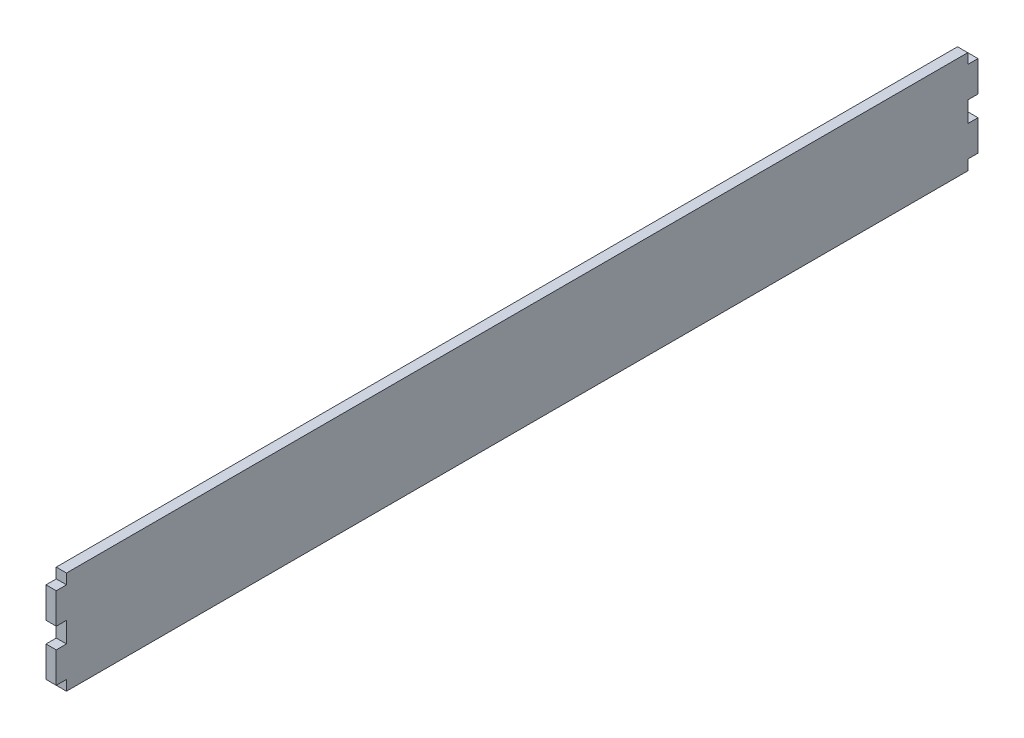
ISO-10303-21;
HEADER;
FILE_DESCRIPTION(('STEP AP214'),'2;1');
FILE_NAME('part.step','',(''),(''),'','','');
FILE_SCHEMA(('AUTOMOTIVE_DESIGN { 1 0 10303 214 1 1 1 1 }'));
ENDSEC;
DATA;
#1=APPLICATION_CONTEXT('core data for automotive mechanical design processes');
#2=APPLICATION_PROTOCOL_DEFINITION('international standard','automotive_design',2000,#1);
#3=PRODUCT_CONTEXT('',#1,'mechanical');
#4=PRODUCT('Part','Part','',(#3));
#5=PRODUCT_RELATED_PRODUCT_CATEGORY('part','',(#4));
#6=PRODUCT_DEFINITION_FORMATION('','',#4);
#7=PRODUCT_DEFINITION_CONTEXT('part definition',#1,'design');
#8=PRODUCT_DEFINITION('design','',#6,#7);
#9=PRODUCT_DEFINITION_SHAPE('','',#8);
#10=(LENGTH_UNIT() NAMED_UNIT(*) SI_UNIT(.MILLI.,.METRE.));
#11=(NAMED_UNIT(*) PLANE_ANGLE_UNIT() SI_UNIT($,.RADIAN.));
#12=(NAMED_UNIT(*) SI_UNIT($,.STERADIAN.) SOLID_ANGLE_UNIT());
#13=UNCERTAINTY_MEASURE_WITH_UNIT(LENGTH_MEASURE(1.E-05),#10,'distance_accuracy_value','');
#14=(GEOMETRIC_REPRESENTATION_CONTEXT(3) GLOBAL_UNCERTAINTY_ASSIGNED_CONTEXT((#13)) GLOBAL_UNIT_ASSIGNED_CONTEXT((#10,
#11,#12)) REPRESENTATION_CONTEXT('',''));
#15=CARTESIAN_POINT('',(0.,0.,0.));
#16=DIRECTION('',(0.,0.,1.));
#17=DIRECTION('',(1.,0.,0.));
#18=AXIS2_PLACEMENT_3D('',#15,#16,#17);
#19=CARTESIAN_POINT('',(5.,-20.,-220.));
#20=DIRECTION('',(0.,0.,1.));
#21=DIRECTION('',(1.,0.,0.));
#22=AXIS2_PLACEMENT_3D('',#19,#20,#21);
#23=PLANE('',#22);
#24=DIRECTION('',(0.,1.,0.));
#25=VECTOR('',#24,1.);
#26=CARTESIAN_POINT('',(0.,-20.,-220.));
#27=LINE('',#26,#25);
#28=CARTESIAN_POINT('',(0.,-25.,-220.));
#29=VERTEX_POINT('',#28);
#30=CARTESIAN_POINT('',(0.,-20.,-220.));
#31=VERTEX_POINT('',#30);
#32=EDGE_CURVE('E216',#29,#31,#27,.T.);
#33=ORIENTED_EDGE('',*,*,#32,.T.);
#34=DIRECTION('',(-1.,0.,0.));
#35=VECTOR('',#34,1.);
#36=CARTESIAN_POINT('',(5.,-20.,-220.));
#37=LINE('',#36,#35);
#38=CARTESIAN_POINT('',(5.,-20.,-220.));
#39=VERTEX_POINT('',#38);
#40=EDGE_CURVE('E11',#39,#31,#37,.T.);
#41=ORIENTED_EDGE('',*,*,#40,.F.);
#42=DIRECTION('',(0.,1.,0.));
#43=VECTOR('',#42,1.);
#44=CARTESIAN_POINT('',(5.,-20.,-220.));
#45=LINE('',#44,#43);
#46=CARTESIAN_POINT('',(5.,-25.,-220.));
#47=VERTEX_POINT('',#46);
#48=EDGE_CURVE('E274',#47,#39,#45,.T.);
#49=ORIENTED_EDGE('',*,*,#48,.F.);
#50=DIRECTION('',(-1.,0.,0.));
#51=VECTOR('',#50,1.);
#52=CARTESIAN_POINT('',(5.,-25.,-220.));
#53=LINE('',#52,#51);
#54=EDGE_CURVE('E212',#47,#29,#53,.T.);
#55=ORIENTED_EDGE('',*,*,#54,.T.);
#56=EDGE_LOOP('',(#33,#41,#49,#55));
#57=FACE_BOUND('',#56,.T.);
#58=ADVANCED_FACE('F43',(#57),#23,.F.);
#59=CARTESIAN_POINT('',(5.,-20.,-220.));
#60=DIRECTION('',(0.,1.,0.));
#61=DIRECTION('',(0.,0.,1.));
#62=AXIS2_PLACEMENT_3D('',#59,#60,#61);
#63=PLANE('',#62);
#64=DIRECTION('',(0.,0.,-1.));
#65=VECTOR('',#64,1.);
#66=CARTESIAN_POINT('',(0.,-20.,-220.));
#67=LINE('',#66,#65);
#68=CARTESIAN_POINT('',(0.,-20.,-225.));
#69=VERTEX_POINT('',#68);
#70=EDGE_CURVE('E220',#31,#69,#67,.T.);
#71=ORIENTED_EDGE('',*,*,#70,.T.);
#72=DIRECTION('',(-1.,0.,0.));
#73=VECTOR('',#72,1.);
#74=CARTESIAN_POINT('',(5.,-20.,-225.));
#75=LINE('',#74,#73);
#76=CARTESIAN_POINT('',(5.,-20.,-225.));
#77=VERTEX_POINT('',#76);
#78=EDGE_CURVE('E52',#77,#69,#75,.T.);
#79=ORIENTED_EDGE('',*,*,#78,.F.);
#80=DIRECTION('',(0.,0.,-1.));
#81=VECTOR('',#80,1.);
#82=CARTESIAN_POINT('',(5.,-20.,-220.));
#83=LINE('',#82,#81);
#84=EDGE_CURVE('E139',#39,#77,#83,.T.);
#85=ORIENTED_EDGE('',*,*,#84,.F.);
#86=ORIENTED_EDGE('',*,*,#40,.T.);
#87=EDGE_LOOP('',(#71,#79,#85,#86));
#88=FACE_BOUND('',#87,.T.);
#89=ADVANCED_FACE('F424',(#88),#63,.F.);
#90=CARTESIAN_POINT('',(5.,-5.,-225.));
#91=DIRECTION('',(0.,0.,1.));
#92=DIRECTION('',(1.,0.,0.));
#93=AXIS2_PLACEMENT_3D('',#90,#91,#92);
#94=PLANE('',#93);
#95=DIRECTION('',(0.,1.,0.));
#96=VECTOR('',#95,1.);
#97=CARTESIAN_POINT('',(0.,-5.,-225.));
#98=LINE('',#97,#96);
#99=CARTESIAN_POINT('',(0.,-5.,-225.));
#100=VERTEX_POINT('',#99);
#101=EDGE_CURVE('E223',#69,#100,#98,.T.);
#102=ORIENTED_EDGE('',*,*,#101,.T.);
#103=DIRECTION('',(-1.,0.,0.));
#104=VECTOR('',#103,1.);
#105=CARTESIAN_POINT('',(5.,-5.,-225.));
#106=LINE('',#105,#104);
#107=CARTESIAN_POINT('',(5.,-5.,-225.));
#108=VERTEX_POINT('',#107);
#109=EDGE_CURVE('E333',#108,#100,#106,.T.);
#110=ORIENTED_EDGE('',*,*,#109,.F.);
#111=DIRECTION('',(0.,1.,0.));
#112=VECTOR('',#111,1.);
#113=CARTESIAN_POINT('',(5.,-5.,-225.));
#114=LINE('',#113,#112);
#115=EDGE_CURVE('E343',#77,#108,#114,.T.);
#116=ORIENTED_EDGE('',*,*,#115,.F.);
#117=ORIENTED_EDGE('',*,*,#78,.T.);
#118=EDGE_LOOP('',(#102,#110,#116,#117));
#119=FACE_BOUND('',#118,.T.);
#120=ADVANCED_FACE('F341',(#119),#94,.F.);
#121=CARTESIAN_POINT('',(5.,-5.,-220.));
#122=DIRECTION('',(0.,-1.,0.));
#123=DIRECTION('',(0.,0.,-1.));
#124=AXIS2_PLACEMENT_3D('',#121,#122,#123);
#125=PLANE('',#124);
#126=DIRECTION('',(0.,0.,1.));
#127=VECTOR('',#126,1.);
#128=CARTESIAN_POINT('',(0.,-5.,-220.));
#129=LINE('',#128,#127);
#130=CARTESIAN_POINT('',(0.,-5.,-220.));
#131=VERTEX_POINT('',#130);
#132=EDGE_CURVE('E226',#100,#131,#129,.T.);
#133=ORIENTED_EDGE('',*,*,#132,.T.);
#134=DIRECTION('',(-1.,0.,0.));
#135=VECTOR('',#134,1.);
#136=CARTESIAN_POINT('',(5.,-5.,-220.));
#137=LINE('',#136,#135);
#138=CARTESIAN_POINT('',(5.,-5.,-220.));
#139=VERTEX_POINT('',#138);
#140=EDGE_CURVE('E329',#139,#131,#137,.T.);
#141=ORIENTED_EDGE('',*,*,#140,.F.);
#142=DIRECTION('',(0.,0.,1.));
#143=VECTOR('',#142,1.);
#144=CARTESIAN_POINT('',(5.,-5.,-220.));
#145=LINE('',#144,#143);
#146=EDGE_CURVE('E362',#108,#139,#145,.T.);
#147=ORIENTED_EDGE('',*,*,#146,.F.);
#148=ORIENTED_EDGE('',*,*,#109,.T.);
#149=EDGE_LOOP('',(#133,#141,#147,#148));
#150=FACE_BOUND('',#149,.T.);
#151=ADVANCED_FACE('F352',(#150),#125,.F.);
#152=CARTESIAN_POINT('',(5.,5.,-220.));
#153=DIRECTION('',(0.,0.,1.));
#154=DIRECTION('',(1.,0.,0.));
#155=AXIS2_PLACEMENT_3D('',#152,#153,#154);
#156=PLANE('',#155);
#157=DIRECTION('',(0.,1.,0.));
#158=VECTOR('',#157,1.);
#159=CARTESIAN_POINT('',(0.,5.,-220.));
#160=LINE('',#159,#158);
#161=CARTESIAN_POINT('',(0.,5.,-220.));
#162=VERTEX_POINT('',#161);
#163=EDGE_CURVE('E229',#131,#162,#160,.T.);
#164=ORIENTED_EDGE('',*,*,#163,.T.);
#165=DIRECTION('',(-1.,0.,0.));
#166=VECTOR('',#165,1.);
#167=CARTESIAN_POINT('',(5.,5.,-220.));
#168=LINE('',#167,#166);
#169=CARTESIAN_POINT('',(5.,5.,-220.));
#170=VERTEX_POINT('',#169);
#171=EDGE_CURVE('E325',#170,#162,#168,.T.);
#172=ORIENTED_EDGE('',*,*,#171,.F.);
#173=DIRECTION('',(0.,1.,0.));
#174=VECTOR('',#173,1.);
#175=CARTESIAN_POINT('',(5.,5.,-220.));
#176=LINE('',#175,#174);
#177=EDGE_CURVE('E358',#139,#170,#176,.T.);
#178=ORIENTED_EDGE('',*,*,#177,.F.);
#179=ORIENTED_EDGE('',*,*,#140,.T.);
#180=EDGE_LOOP('',(#164,#172,#178,#179));
#181=FACE_BOUND('',#180,.T.);
#182=ADVANCED_FACE('F356',(#181),#156,.F.);
#183=CARTESIAN_POINT('',(5.,5.,-220.));
#184=DIRECTION('',(0.,1.,0.));
#185=DIRECTION('',(0.,0.,1.));
#186=AXIS2_PLACEMENT_3D('',#183,#184,#185);
#187=PLANE('',#186);
#188=DIRECTION('',(0.,0.,-1.));
#189=VECTOR('',#188,1.);
#190=CARTESIAN_POINT('',(0.,5.,-220.));
#191=LINE('',#190,#189);
#192=CARTESIAN_POINT('',(0.,5.,-225.));
#193=VERTEX_POINT('',#192);
#194=EDGE_CURVE('E232',#162,#193,#191,.T.);
#195=ORIENTED_EDGE('',*,*,#194,.T.);
#196=DIRECTION('',(-1.,0.,0.));
#197=VECTOR('',#196,1.);
#198=CARTESIAN_POINT('',(5.,5.,-225.));
#199=LINE('',#198,#197);
#200=CARTESIAN_POINT('',(5.,5.,-225.));
#201=VERTEX_POINT('',#200);
#202=EDGE_CURVE('E321',#201,#193,#199,.T.);
#203=ORIENTED_EDGE('',*,*,#202,.F.);
#204=DIRECTION('',(0.,0.,-1.));
#205=VECTOR('',#204,1.);
#206=CARTESIAN_POINT('',(5.,5.,-220.));
#207=LINE('',#206,#205);
#208=EDGE_CURVE('E361',#170,#201,#207,.T.);
#209=ORIENTED_EDGE('',*,*,#208,.F.);
#210=ORIENTED_EDGE('',*,*,#171,.T.);
#211=EDGE_LOOP('',(#195,#203,#209,#210));
#212=FACE_BOUND('',#211,.T.);
#213=ADVANCED_FACE('F437',(#212),#187,.F.);
#214=CARTESIAN_POINT('',(5.,20.,-225.));
#215=DIRECTION('',(0.,0.,1.));
#216=DIRECTION('',(1.,0.,0.));
#217=AXIS2_PLACEMENT_3D('',#214,#215,#216);
#218=PLANE('',#217);
#219=DIRECTION('',(0.,1.,0.));
#220=VECTOR('',#219,1.);
#221=CARTESIAN_POINT('',(0.,20.,-225.));
#222=LINE('',#221,#220);
#223=CARTESIAN_POINT('',(0.,20.,-225.));
#224=VERTEX_POINT('',#223);
#225=EDGE_CURVE('E235',#193,#224,#222,.T.);
#226=ORIENTED_EDGE('',*,*,#225,.T.);
#227=DIRECTION('',(-1.,0.,0.));
#228=VECTOR('',#227,1.);
#229=CARTESIAN_POINT('',(5.,20.,-225.));
#230=LINE('',#229,#228);
#231=CARTESIAN_POINT('',(5.,20.,-225.));
#232=VERTEX_POINT('',#231);
#233=EDGE_CURVE('E317',#232,#224,#230,.T.);
#234=ORIENTED_EDGE('',*,*,#233,.F.);
#235=DIRECTION('',(0.,1.,0.));
#236=VECTOR('',#235,1.);
#237=CARTESIAN_POINT('',(5.,20.,-225.));
#238=LINE('',#237,#236);
#239=EDGE_CURVE('E366',#201,#232,#238,.T.);
#240=ORIENTED_EDGE('',*,*,#239,.F.);
#241=ORIENTED_EDGE('',*,*,#202,.T.);
#242=EDGE_LOOP('',(#226,#234,#240,#241));
#243=FACE_BOUND('',#242,.T.);
#244=ADVANCED_FACE('F440',(#243),#218,.F.);
#245=CARTESIAN_POINT('',(5.,20.,-220.));
#246=DIRECTION('',(0.,-1.,0.));
#247=DIRECTION('',(0.,0.,-1.));
#248=AXIS2_PLACEMENT_3D('',#245,#246,#247);
#249=PLANE('',#248);
#250=DIRECTION('',(0.,0.,1.));
#251=VECTOR('',#250,1.);
#252=CARTESIAN_POINT('',(0.,20.,-220.));
#253=LINE('',#252,#251);
#254=CARTESIAN_POINT('',(0.,20.,-220.));
#255=VERTEX_POINT('',#254);
#256=EDGE_CURVE('E238',#224,#255,#253,.T.);
#257=ORIENTED_EDGE('',*,*,#256,.T.);
#258=DIRECTION('',(-1.,0.,0.));
#259=VECTOR('',#258,1.);
#260=CARTESIAN_POINT('',(5.,20.,-220.));
#261=LINE('',#260,#259);
#262=CARTESIAN_POINT('',(5.,20.,-220.));
#263=VERTEX_POINT('',#262);
#264=EDGE_CURVE('E313',#263,#255,#261,.T.);
#265=ORIENTED_EDGE('',*,*,#264,.F.);
#266=DIRECTION('',(0.,0.,1.));
#267=VECTOR('',#266,1.);
#268=CARTESIAN_POINT('',(5.,20.,-220.));
#269=LINE('',#268,#267);
#270=EDGE_CURVE('E373',#232,#263,#269,.T.);
#271=ORIENTED_EDGE('',*,*,#270,.F.);
#272=ORIENTED_EDGE('',*,*,#233,.T.);
#273=EDGE_LOOP('',(#257,#265,#271,#272));
#274=FACE_BOUND('',#273,.T.);
#275=ADVANCED_FACE('F444',(#274),#249,.F.);
#276=CARTESIAN_POINT('',(5.,25.,-220.));
#277=DIRECTION('',(0.,0.,1.));
#278=DIRECTION('',(1.,0.,0.));
#279=AXIS2_PLACEMENT_3D('',#276,#277,#278);
#280=PLANE('',#279);
#281=DIRECTION('',(0.,1.,0.));
#282=VECTOR('',#281,1.);
#283=CARTESIAN_POINT('',(0.,25.,-220.));
#284=LINE('',#283,#282);
#285=CARTESIAN_POINT('',(0.,25.,-220.));
#286=VERTEX_POINT('',#285);
#287=EDGE_CURVE('E241',#255,#286,#284,.T.);
#288=ORIENTED_EDGE('',*,*,#287,.T.);
#289=DIRECTION('',(-1.,0.,0.));
#290=VECTOR('',#289,1.);
#291=CARTESIAN_POINT('',(5.,25.,-220.));
#292=LINE('',#291,#290);
#293=CARTESIAN_POINT('',(5.,25.,-220.));
#294=VERTEX_POINT('',#293);
#295=EDGE_CURVE('E309',#294,#286,#292,.T.);
#296=ORIENTED_EDGE('',*,*,#295,.F.);
#297=DIRECTION('',(0.,1.,0.));
#298=VECTOR('',#297,1.);
#299=CARTESIAN_POINT('',(5.,25.,-220.));
#300=LINE('',#299,#298);
#301=EDGE_CURVE('E376',#263,#294,#300,.T.);
#302=ORIENTED_EDGE('',*,*,#301,.F.);
#303=ORIENTED_EDGE('',*,*,#264,.T.);
#304=EDGE_LOOP('',(#288,#296,#302,#303));
#305=FACE_BOUND('',#304,.T.);
#306=ADVANCED_FACE('F448',(#305),#280,.F.);
#307=CARTESIAN_POINT('',(5.,25.,220.));
#308=DIRECTION('',(0.,-1.,0.));
#309=DIRECTION('',(0.,0.,-1.));
#310=AXIS2_PLACEMENT_3D('',#307,#308,#309);
#311=PLANE('',#310);
#312=DIRECTION('',(0.,0.,1.));
#313=VECTOR('',#312,1.);
#314=CARTESIAN_POINT('',(0.,25.,220.));
#315=LINE('',#314,#313);
#316=CARTESIAN_POINT('',(0.,25.,220.));
#317=VERTEX_POINT('',#316);
#318=EDGE_CURVE('E244',#286,#317,#315,.T.);
#319=ORIENTED_EDGE('',*,*,#318,.T.);
#320=DIRECTION('',(-1.,0.,0.));
#321=VECTOR('',#320,1.);
#322=CARTESIAN_POINT('',(5.,25.,220.));
#323=LINE('',#322,#321);
#324=CARTESIAN_POINT('',(5.,25.,220.));
#325=VERTEX_POINT('',#324);
#326=EDGE_CURVE('E305',#325,#317,#323,.T.);
#327=ORIENTED_EDGE('',*,*,#326,.F.);
#328=DIRECTION('',(0.,0.,1.));
#329=VECTOR('',#328,1.);
#330=CARTESIAN_POINT('',(5.,25.,220.));
#331=LINE('',#330,#329);
#332=EDGE_CURVE('E379',#294,#325,#331,.T.);
#333=ORIENTED_EDGE('',*,*,#332,.F.);
#334=ORIENTED_EDGE('',*,*,#295,.T.);
#335=EDGE_LOOP('',(#319,#327,#333,#334));
#336=FACE_BOUND('',#335,.T.);
#337=ADVANCED_FACE('F452',(#336),#311,.F.);
#338=CARTESIAN_POINT('',(5.,25.,220.));
#339=DIRECTION('',(0.,0.,-1.));
#340=DIRECTION('',(-1.,0.,0.));
#341=AXIS2_PLACEMENT_3D('',#338,#339,#340);
#342=PLANE('',#341);
#343=DIRECTION('',(0.,-1.,0.));
#344=VECTOR('',#343,1.);
#345=CARTESIAN_POINT('',(0.,25.,220.));
#346=LINE('',#345,#344);
#347=CARTESIAN_POINT('',(0.,20.,220.));
#348=VERTEX_POINT('',#347);
#349=EDGE_CURVE('E247',#317,#348,#346,.T.);
#350=ORIENTED_EDGE('',*,*,#349,.T.);
#351=DIRECTION('',(-1.,0.,0.));
#352=VECTOR('',#351,1.);
#353=CARTESIAN_POINT('',(5.,20.,220.));
#354=LINE('',#353,#352);
#355=CARTESIAN_POINT('',(5.,20.,220.));
#356=VERTEX_POINT('',#355);
#357=EDGE_CURVE('E301',#356,#348,#354,.T.);
#358=ORIENTED_EDGE('',*,*,#357,.F.);
#359=DIRECTION('',(0.,-1.,0.));
#360=VECTOR('',#359,1.);
#361=CARTESIAN_POINT('',(5.,25.,220.));
#362=LINE('',#361,#360);
#363=EDGE_CURVE('E382',#325,#356,#362,.T.);
#364=ORIENTED_EDGE('',*,*,#363,.F.);
#365=ORIENTED_EDGE('',*,*,#326,.T.);
#366=EDGE_LOOP('',(#350,#358,#364,#365));
#367=FACE_BOUND('',#366,.T.);
#368=ADVANCED_FACE('F456',(#367),#342,.F.);
#369=CARTESIAN_POINT('',(5.,20.,220.));
#370=DIRECTION('',(0.,-1.,0.));
#371=DIRECTION('',(0.,0.,-1.));
#372=AXIS2_PLACEMENT_3D('',#369,#370,#371);
#373=PLANE('',#372);
#374=DIRECTION('',(0.,0.,1.));
#375=VECTOR('',#374,1.);
#376=CARTESIAN_POINT('',(0.,20.,220.));
#377=LINE('',#376,#375);
#378=CARTESIAN_POINT('',(0.,20.,225.));
#379=VERTEX_POINT('',#378);
#380=EDGE_CURVE('E250',#348,#379,#377,.T.);
#381=ORIENTED_EDGE('',*,*,#380,.T.);
#382=DIRECTION('',(-1.,0.,0.));
#383=VECTOR('',#382,1.);
#384=CARTESIAN_POINT('',(5.,20.,225.));
#385=LINE('',#384,#383);
#386=CARTESIAN_POINT('',(5.,20.,225.));
#387=VERTEX_POINT('',#386);
#388=EDGE_CURVE('E297',#387,#379,#385,.T.);
#389=ORIENTED_EDGE('',*,*,#388,.F.);
#390=DIRECTION('',(0.,0.,1.));
#391=VECTOR('',#390,1.);
#392=CARTESIAN_POINT('',(5.,20.,220.));
#393=LINE('',#392,#391);
#394=EDGE_CURVE('E385',#356,#387,#393,.T.);
#395=ORIENTED_EDGE('',*,*,#394,.F.);
#396=ORIENTED_EDGE('',*,*,#357,.T.);
#397=EDGE_LOOP('',(#381,#389,#395,#396));
#398=FACE_BOUND('',#397,.T.);
#399=ADVANCED_FACE('F460',(#398),#373,.F.);
#400=CARTESIAN_POINT('',(5.,20.,225.));
#401=DIRECTION('',(0.,0.,-1.));
#402=DIRECTION('',(-1.,0.,0.));
#403=AXIS2_PLACEMENT_3D('',#400,#401,#402);
#404=PLANE('',#403);
#405=DIRECTION('',(0.,-1.,0.));
#406=VECTOR('',#405,1.);
#407=CARTESIAN_POINT('',(0.,20.,225.));
#408=LINE('',#407,#406);
#409=CARTESIAN_POINT('',(0.,5.,225.));
#410=VERTEX_POINT('',#409);
#411=EDGE_CURVE('E253',#379,#410,#408,.T.);
#412=ORIENTED_EDGE('',*,*,#411,.T.);
#413=DIRECTION('',(-1.,0.,0.));
#414=VECTOR('',#413,1.);
#415=CARTESIAN_POINT('',(5.,5.,225.));
#416=LINE('',#415,#414);
#417=CARTESIAN_POINT('',(5.,5.,225.));
#418=VERTEX_POINT('',#417);
#419=EDGE_CURVE('E293',#418,#410,#416,.T.);
#420=ORIENTED_EDGE('',*,*,#419,.F.);
#421=DIRECTION('',(0.,-1.,0.));
#422=VECTOR('',#421,1.);
#423=CARTESIAN_POINT('',(5.,20.,225.));
#424=LINE('',#423,#422);
#425=EDGE_CURVE('E388',#387,#418,#424,.T.);
#426=ORIENTED_EDGE('',*,*,#425,.F.);
#427=ORIENTED_EDGE('',*,*,#388,.T.);
#428=EDGE_LOOP('',(#412,#420,#426,#427));
#429=FACE_BOUND('',#428,.T.);
#430=ADVANCED_FACE('F464',(#429),#404,.F.);
#431=CARTESIAN_POINT('',(5.,5.,220.));
#432=DIRECTION('',(0.,1.,0.));
#433=DIRECTION('',(0.,0.,1.));
#434=AXIS2_PLACEMENT_3D('',#431,#432,#433);
#435=PLANE('',#434);
#436=DIRECTION('',(0.,0.,-1.));
#437=VECTOR('',#436,1.);
#438=CARTESIAN_POINT('',(0.,5.,220.));
#439=LINE('',#438,#437);
#440=CARTESIAN_POINT('',(0.,5.,220.));
#441=VERTEX_POINT('',#440);
#442=EDGE_CURVE('E256',#410,#441,#439,.T.);
#443=ORIENTED_EDGE('',*,*,#442,.T.);
#444=DIRECTION('',(-1.,0.,0.));
#445=VECTOR('',#444,1.);
#446=CARTESIAN_POINT('',(5.,5.,220.));
#447=LINE('',#446,#445);
#448=CARTESIAN_POINT('',(5.,5.,220.));
#449=VERTEX_POINT('',#448);
#450=EDGE_CURVE('E289',#449,#441,#447,.T.);
#451=ORIENTED_EDGE('',*,*,#450,.F.);
#452=DIRECTION('',(0.,0.,-1.));
#453=VECTOR('',#452,1.);
#454=CARTESIAN_POINT('',(5.,5.,220.));
#455=LINE('',#454,#453);
#456=EDGE_CURVE('E391',#418,#449,#455,.T.);
#457=ORIENTED_EDGE('',*,*,#456,.F.);
#458=ORIENTED_EDGE('',*,*,#419,.T.);
#459=EDGE_LOOP('',(#443,#451,#457,#458));
#460=FACE_BOUND('',#459,.T.);
#461=ADVANCED_FACE('F468',(#460),#435,.F.);
#462=CARTESIAN_POINT('',(5.,5.,220.));
#463=DIRECTION('',(0.,0.,-1.));
#464=DIRECTION('',(-1.,0.,0.));
#465=AXIS2_PLACEMENT_3D('',#462,#463,#464);
#466=PLANE('',#465);
#467=DIRECTION('',(0.,-1.,0.));
#468=VECTOR('',#467,1.);
#469=CARTESIAN_POINT('',(0.,5.,220.));
#470=LINE('',#469,#468);
#471=CARTESIAN_POINT('',(0.,-5.,220.));
#472=VERTEX_POINT('',#471);
#473=EDGE_CURVE('E259',#441,#472,#470,.T.);
#474=ORIENTED_EDGE('',*,*,#473,.T.);
#475=DIRECTION('',(-1.,0.,0.));
#476=VECTOR('',#475,1.);
#477=CARTESIAN_POINT('',(5.,-5.,220.));
#478=LINE('',#477,#476);
#479=CARTESIAN_POINT('',(5.,-5.,220.));
#480=VERTEX_POINT('',#479);
#481=EDGE_CURVE('E285',#480,#472,#478,.T.);
#482=ORIENTED_EDGE('',*,*,#481,.F.);
#483=DIRECTION('',(0.,-1.,0.));
#484=VECTOR('',#483,1.);
#485=CARTESIAN_POINT('',(5.,5.,220.));
#486=LINE('',#485,#484);
#487=EDGE_CURVE('E394',#449,#480,#486,.T.);
#488=ORIENTED_EDGE('',*,*,#487,.F.);
#489=ORIENTED_EDGE('',*,*,#450,.T.);
#490=EDGE_LOOP('',(#474,#482,#488,#489));
#491=FACE_BOUND('',#490,.T.);
#492=ADVANCED_FACE('F472',(#491),#466,.F.);
#493=CARTESIAN_POINT('',(5.,-5.,220.));
#494=DIRECTION('',(0.,-1.,0.));
#495=DIRECTION('',(0.,0.,-1.));
#496=AXIS2_PLACEMENT_3D('',#493,#494,#495);
#497=PLANE('',#496);
#498=DIRECTION('',(0.,0.,1.));
#499=VECTOR('',#498,1.);
#500=CARTESIAN_POINT('',(0.,-5.,220.));
#501=LINE('',#500,#499);
#502=CARTESIAN_POINT('',(0.,-5.,225.));
#503=VERTEX_POINT('',#502);
#504=EDGE_CURVE('E262',#472,#503,#501,.T.);
#505=ORIENTED_EDGE('',*,*,#504,.T.);
#506=DIRECTION('',(-1.,0.,0.));
#507=VECTOR('',#506,1.);
#508=CARTESIAN_POINT('',(5.,-5.,225.));
#509=LINE('',#508,#507);
#510=CARTESIAN_POINT('',(5.,-5.,225.));
#511=VERTEX_POINT('',#510);
#512=EDGE_CURVE('E281',#511,#503,#509,.T.);
#513=ORIENTED_EDGE('',*,*,#512,.F.);
#514=DIRECTION('',(0.,0.,1.));
#515=VECTOR('',#514,1.);
#516=CARTESIAN_POINT('',(5.,-5.,220.));
#517=LINE('',#516,#515);
#518=EDGE_CURVE('E397',#480,#511,#517,.T.);
#519=ORIENTED_EDGE('',*,*,#518,.F.);
#520=ORIENTED_EDGE('',*,*,#481,.T.);
#521=EDGE_LOOP('',(#505,#513,#519,#520));
#522=FACE_BOUND('',#521,.T.);
#523=ADVANCED_FACE('F405',(#522),#497,.F.);
#524=CARTESIAN_POINT('',(5.,-5.,225.));
#525=DIRECTION('',(0.,0.,-1.));
#526=DIRECTION('',(-1.,0.,0.));
#527=AXIS2_PLACEMENT_3D('',#524,#525,#526);
#528=PLANE('',#527);
#529=DIRECTION('',(0.,-1.,0.));
#530=VECTOR('',#529,1.);
#531=CARTESIAN_POINT('',(0.,-5.,225.));
#532=LINE('',#531,#530);
#533=CARTESIAN_POINT('',(0.,-20.,225.));
#534=VERTEX_POINT('',#533);
#535=EDGE_CURVE('E265',#503,#534,#532,.T.);
#536=ORIENTED_EDGE('',*,*,#535,.T.);
#537=DIRECTION('',(-1.,0.,0.));
#538=VECTOR('',#537,1.);
#539=CARTESIAN_POINT('',(5.,-20.,225.));
#540=LINE('',#539,#538);
#541=CARTESIAN_POINT('',(5.,-20.,225.));
#542=VERTEX_POINT('',#541);
#543=EDGE_CURVE('E205',#542,#534,#540,.T.);
#544=ORIENTED_EDGE('',*,*,#543,.F.);
#545=DIRECTION('',(0.,-1.,0.));
#546=VECTOR('',#545,1.);
#547=CARTESIAN_POINT('',(5.,-5.,225.));
#548=LINE('',#547,#546);
#549=EDGE_CURVE('E194',#511,#542,#548,.T.);
#550=ORIENTED_EDGE('',*,*,#549,.F.);
#551=ORIENTED_EDGE('',*,*,#512,.T.);
#552=EDGE_LOOP('',(#536,#544,#550,#551));
#553=FACE_BOUND('',#552,.T.);
#554=ADVANCED_FACE('F409',(#553),#528,.F.);
#555=CARTESIAN_POINT('',(5.,-20.,220.));
#556=DIRECTION('',(0.,1.,0.));
#557=DIRECTION('',(0.,0.,1.));
#558=AXIS2_PLACEMENT_3D('',#555,#556,#557);
#559=PLANE('',#558);
#560=DIRECTION('',(0.,0.,-1.));
#561=VECTOR('',#560,1.);
#562=CARTESIAN_POINT('',(0.,-20.,220.));
#563=LINE('',#562,#561);
#564=CARTESIAN_POINT('',(0.,-20.,220.));
#565=VERTEX_POINT('',#564);
#566=EDGE_CURVE('E203',#534,#565,#563,.T.);
#567=ORIENTED_EDGE('',*,*,#566,.T.);
#568=DIRECTION('',(-1.,0.,0.));
#569=VECTOR('',#568,1.);
#570=CARTESIAN_POINT('',(5.,-20.,220.));
#571=LINE('',#570,#569);
#572=CARTESIAN_POINT('',(5.,-20.,220.));
#573=VERTEX_POINT('',#572);
#574=EDGE_CURVE('E200',#573,#565,#571,.T.);
#575=ORIENTED_EDGE('',*,*,#574,.F.);
#576=DIRECTION('',(0.,0.,-1.));
#577=VECTOR('',#576,1.);
#578=CARTESIAN_POINT('',(5.,-20.,220.));
#579=LINE('',#578,#577);
#580=EDGE_CURVE('E188',#542,#573,#579,.T.);
#581=ORIENTED_EDGE('',*,*,#580,.F.);
#582=ORIENTED_EDGE('',*,*,#543,.T.);
#583=EDGE_LOOP('',(#567,#575,#581,#582));
#584=FACE_BOUND('',#583,.T.);
#585=ADVANCED_FACE('F201',(#584),#559,.F.);
#586=CARTESIAN_POINT('',(5.,-20.,220.));
#587=DIRECTION('',(0.,0.,-1.));
#588=DIRECTION('',(0.,1.,0.));
#589=AXIS2_PLACEMENT_3D('',#586,#587,#588);
#590=PLANE('',#589);
#591=DIRECTION('',(0.,-1.,0.));
#592=VECTOR('',#591,1.);
#593=CARTESIAN_POINT('',(0.,-20.,220.));
#594=LINE('',#593,#592);
#595=CARTESIAN_POINT('',(0.,-25.,220.));
#596=VERTEX_POINT('',#595);
#597=EDGE_CURVE('E125',#565,#596,#594,.T.);
#598=ORIENTED_EDGE('',*,*,#597,.T.);
#599=DIRECTION('',(-1.,0.,0.));
#600=VECTOR('',#599,1.);
#601=CARTESIAN_POINT('',(5.,-25.,220.));
#602=LINE('',#601,#600);
#603=CARTESIAN_POINT('',(5.,-25.,220.));
#604=VERTEX_POINT('',#603);
#605=EDGE_CURVE('E206',#604,#596,#602,.T.);
#606=ORIENTED_EDGE('',*,*,#605,.F.);
#607=DIRECTION('',(0.,-1.,0.));
#608=VECTOR('',#607,1.);
#609=CARTESIAN_POINT('',(5.,-20.,220.));
#610=LINE('',#609,#608);
#611=EDGE_CURVE('E192',#573,#604,#610,.T.);
#612=ORIENTED_EDGE('',*,*,#611,.F.);
#613=ORIENTED_EDGE('',*,*,#574,.T.);
#614=EDGE_LOOP('',(#598,#606,#612,#613));
#615=FACE_BOUND('',#614,.T.);
#616=ADVANCED_FACE('F208',(#615),#590,.F.);
#617=CARTESIAN_POINT('',(5.,-25.,220.));
#618=DIRECTION('',(0.,1.,0.));
#619=DIRECTION('',(0.,0.,1.));
#620=AXIS2_PLACEMENT_3D('',#617,#618,#619);
#621=PLANE('',#620);
#622=DIRECTION('',(0.,0.,-1.));
#623=VECTOR('',#622,1.);
#624=CARTESIAN_POINT('',(0.,-25.,220.));
#625=LINE('',#624,#623);
#626=EDGE_CURVE('E131',#596,#29,#625,.T.);
#627=ORIENTED_EDGE('',*,*,#626,.T.);
#628=ORIENTED_EDGE('',*,*,#54,.F.);
#629=DIRECTION('',(0.,0.,-1.));
#630=VECTOR('',#629,1.);
#631=CARTESIAN_POINT('',(5.,-25.,220.));
#632=LINE('',#631,#630);
#633=EDGE_CURVE('E60',#604,#47,#632,.T.);
#634=ORIENTED_EDGE('',*,*,#633,.F.);
#635=ORIENTED_EDGE('',*,*,#605,.T.);
#636=EDGE_LOOP('',(#627,#628,#634,#635));
#637=FACE_BOUND('',#636,.T.);
#638=ADVANCED_FACE('F413',(#637),#621,.F.);
#639=CARTESIAN_POINT('',(5.,0.,0.));
#640=DIRECTION('',(1.,0.,0.));
#641=DIRECTION('',(0.,0.,-1.));
#642=AXIS2_PLACEMENT_3D('',#639,#640,#641);
#643=PLANE('',#642);
#644=ORIENTED_EDGE('',*,*,#48,.T.);
#645=ORIENTED_EDGE('',*,*,#84,.T.);
#646=ORIENTED_EDGE('',*,*,#115,.T.);
#647=ORIENTED_EDGE('',*,*,#146,.T.);
#648=ORIENTED_EDGE('',*,*,#177,.T.);
#649=ORIENTED_EDGE('',*,*,#208,.T.);
#650=ORIENTED_EDGE('',*,*,#239,.T.);
#651=ORIENTED_EDGE('',*,*,#270,.T.);
#652=ORIENTED_EDGE('',*,*,#301,.T.);
#653=ORIENTED_EDGE('',*,*,#332,.T.);
#654=ORIENTED_EDGE('',*,*,#363,.T.);
#655=ORIENTED_EDGE('',*,*,#394,.T.);
#656=ORIENTED_EDGE('',*,*,#425,.T.);
#657=ORIENTED_EDGE('',*,*,#456,.T.);
#658=ORIENTED_EDGE('',*,*,#487,.T.);
#659=ORIENTED_EDGE('',*,*,#518,.T.);
#660=ORIENTED_EDGE('',*,*,#549,.T.);
#661=ORIENTED_EDGE('',*,*,#580,.T.);
#662=ORIENTED_EDGE('',*,*,#611,.T.);
#663=ORIENTED_EDGE('',*,*,#633,.T.);
#664=EDGE_LOOP('',(#644,#645,#646,#647,#648,#649,#650,#651,#652,#653,#654,#655,#656,#657,#658,
#659,#660,#661,#662,#663));
#665=FACE_BOUND('',#664,.T.);
#666=ADVANCED_FACE('F190',(#665),#643,.T.);
#667=CARTESIAN_POINT('',(0.,0.,0.));
#668=DIRECTION('',(1.,0.,0.));
#669=DIRECTION('',(0.,0.,-1.));
#670=AXIS2_PLACEMENT_3D('',#667,#668,#669);
#671=PLANE('',#670);
#672=ORIENTED_EDGE('',*,*,#32,.F.);
#673=ORIENTED_EDGE('',*,*,#626,.F.);
#674=ORIENTED_EDGE('',*,*,#597,.F.);
#675=ORIENTED_EDGE('',*,*,#566,.F.);
#676=ORIENTED_EDGE('',*,*,#535,.F.);
#677=ORIENTED_EDGE('',*,*,#504,.F.);
#678=ORIENTED_EDGE('',*,*,#473,.F.);
#679=ORIENTED_EDGE('',*,*,#442,.F.);
#680=ORIENTED_EDGE('',*,*,#411,.F.);
#681=ORIENTED_EDGE('',*,*,#380,.F.);
#682=ORIENTED_EDGE('',*,*,#349,.F.);
#683=ORIENTED_EDGE('',*,*,#318,.F.);
#684=ORIENTED_EDGE('',*,*,#287,.F.);
#685=ORIENTED_EDGE('',*,*,#256,.F.);
#686=ORIENTED_EDGE('',*,*,#225,.F.);
#687=ORIENTED_EDGE('',*,*,#194,.F.);
#688=ORIENTED_EDGE('',*,*,#163,.F.);
#689=ORIENTED_EDGE('',*,*,#132,.F.);
#690=ORIENTED_EDGE('',*,*,#101,.F.);
#691=ORIENTED_EDGE('',*,*,#70,.F.);
#692=EDGE_LOOP('',(#672,#673,#674,#675,#676,#677,#678,#679,#680,#681,#682,#683,#684,#685,#686,
#687,#688,#689,#690,#691));
#693=FACE_BOUND('',#692,.T.);
#694=ADVANCED_FACE('F347',(#693),#671,.F.);
#695=CLOSED_SHELL('',(#58,#89,#120,#151,#182,#213,#244,#275,#306,#337,#368,#399,#430,#461,#492,
#523,#554,#585,#616,#638,#666,#694));
#696=MANIFOLD_SOLID_BREP('B2',#695);
#697=ADVANCED_BREP_SHAPE_REPRESENTATION('',(#18,#696),#14);
#698=SHAPE_DEFINITION_REPRESENTATION(#9,#697);
ENDSEC;
END-ISO-10303-21;
